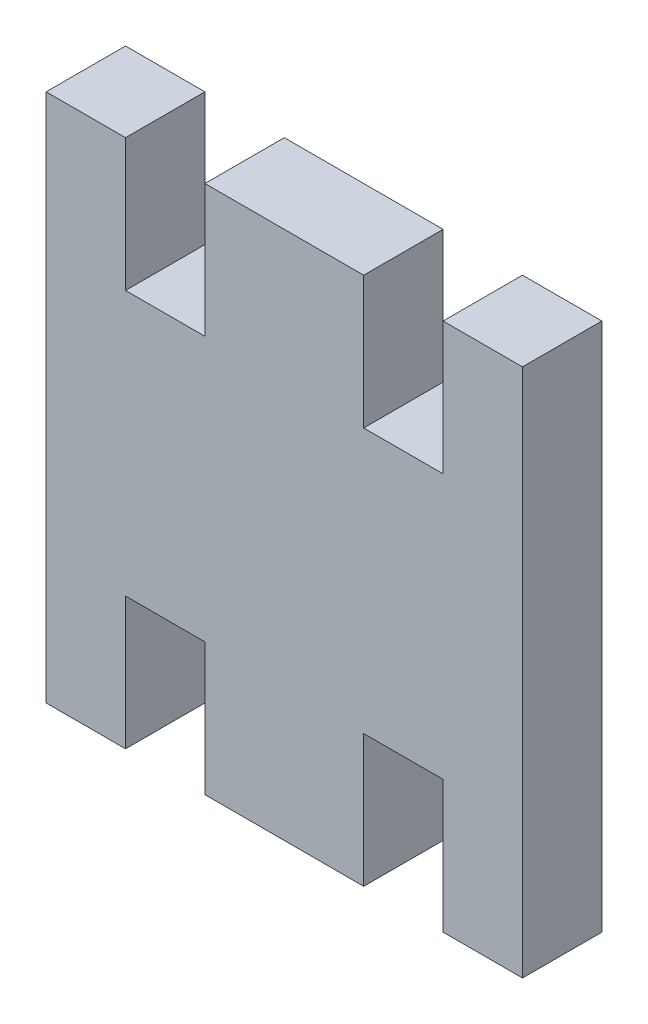
ISO-10303-21;
HEADER;
FILE_DESCRIPTION(('STEP AP214'),'2;1');
FILE_NAME('part.step','',(''),(''),'','','');
FILE_SCHEMA(('AUTOMOTIVE_DESIGN { 1 0 10303 214 1 1 1 1 }'));
ENDSEC;
DATA;
#1=APPLICATION_CONTEXT('core data for automotive mechanical design processes');
#2=APPLICATION_PROTOCOL_DEFINITION('international standard','automotive_design',2000,#1);
#3=PRODUCT_CONTEXT('',#1,'mechanical');
#4=PRODUCT('Part','Part','',(#3));
#5=PRODUCT_RELATED_PRODUCT_CATEGORY('part','',(#4));
#6=PRODUCT_DEFINITION_FORMATION('','',#4);
#7=PRODUCT_DEFINITION_CONTEXT('part definition',#1,'design');
#8=PRODUCT_DEFINITION('design','',#6,#7);
#9=PRODUCT_DEFINITION_SHAPE('','',#8);
#10=(LENGTH_UNIT() NAMED_UNIT(*) SI_UNIT(.MILLI.,.METRE.));
#11=(NAMED_UNIT(*) PLANE_ANGLE_UNIT() SI_UNIT($,.RADIAN.));
#12=(NAMED_UNIT(*) SI_UNIT($,.STERADIAN.) SOLID_ANGLE_UNIT());
#13=UNCERTAINTY_MEASURE_WITH_UNIT(LENGTH_MEASURE(1.E-05),#10,'distance_accuracy_value','');
#14=(GEOMETRIC_REPRESENTATION_CONTEXT(3) GLOBAL_UNCERTAINTY_ASSIGNED_CONTEXT((#13)) GLOBAL_UNIT_ASSIGNED_CONTEXT((#10,
#11,#12)) REPRESENTATION_CONTEXT('',''));
#15=CARTESIAN_POINT('',(0.,0.,0.));
#16=DIRECTION('',(0.,0.,1.));
#17=DIRECTION('',(1.,0.,0.));
#18=AXIS2_PLACEMENT_3D('',#15,#16,#17);
#19=CARTESIAN_POINT('',(0.,40.,6.));
#20=DIRECTION('',(0.,-1.,0.));
#21=DIRECTION('',(1.,0.,0.));
#22=AXIS2_PLACEMENT_3D('',#19,#20,#21);
#23=PLANE('',#22);
#24=DIRECTION('',(-1.,0.,0.));
#25=VECTOR('',#24,1.);
#26=CARTESIAN_POINT('',(0.,40.,6.));
#27=LINE('',#26,#25);
#28=CARTESIAN_POINT('',(-12.,40.,6.));
#29=VERTEX_POINT('',#28);
#30=CARTESIAN_POINT('',(-24.,40.,6.));
#31=VERTEX_POINT('',#30);
#32=EDGE_CURVE('E257',#29,#31,#27,.T.);
#33=ORIENTED_EDGE('',*,*,#32,.F.);
#34=DIRECTION('',(0.,0.,1.));
#35=VECTOR('',#34,1.);
#36=CARTESIAN_POINT('',(-12.,40.,0.));
#37=LINE('',#36,#35);
#38=CARTESIAN_POINT('',(-12.,40.,0.));
#39=VERTEX_POINT('',#38);
#40=EDGE_CURVE('E343',#39,#29,#37,.T.);
#41=ORIENTED_EDGE('',*,*,#40,.F.);
#42=DIRECTION('',(-1.,0.,0.));
#43=VECTOR('',#42,1.);
#44=CARTESIAN_POINT('',(0.,40.,0.));
#45=LINE('',#44,#43);
#46=CARTESIAN_POINT('',(-24.,40.,0.));
#47=VERTEX_POINT('',#46);
#48=EDGE_CURVE('E236',#39,#47,#45,.T.);
#49=ORIENTED_EDGE('',*,*,#48,.T.);
#50=DIRECTION('',(0.,0.,1.));
#51=VECTOR('',#50,1.);
#52=CARTESIAN_POINT('',(-24.,40.,0.));
#53=LINE('',#52,#51);
#54=EDGE_CURVE('E266',#47,#31,#53,.T.);
#55=ORIENTED_EDGE('',*,*,#54,.T.);
#56=EDGE_LOOP('',(#33,#41,#49,#55));
#57=FACE_BOUND('',#56,.T.);
#58=ADVANCED_FACE('F45',(#57),#23,.F.);
#59=CARTESIAN_POINT('',(0.,0.,6.));
#60=DIRECTION('',(0.,1.,0.));
#61=DIRECTION('',(0.,0.,1.));
#62=AXIS2_PLACEMENT_3D('',#59,#60,#61);
#63=PLANE('',#62);
#64=DIRECTION('',(1.,0.,0.));
#65=VECTOR('',#64,1.);
#66=CARTESIAN_POINT('',(0.,0.,0.));
#67=LINE('',#66,#65);
#68=CARTESIAN_POINT('',(-36.,0.,0.));
#69=VERTEX_POINT('',#68);
#70=CARTESIAN_POINT('',(-30.,0.,0.));
#71=VERTEX_POINT('',#70);
#72=EDGE_CURVE('E200',#69,#71,#67,.T.);
#73=ORIENTED_EDGE('',*,*,#72,.T.);
#74=DIRECTION('',(0.,0.,1.));
#75=VECTOR('',#74,1.);
#76=CARTESIAN_POINT('',(-30.,0.,0.));
#77=LINE('',#76,#75);
#78=CARTESIAN_POINT('',(-30.,0.,6.));
#79=VERTEX_POINT('',#78);
#80=EDGE_CURVE('E183',#71,#79,#77,.T.);
#81=ORIENTED_EDGE('',*,*,#80,.T.);
#82=DIRECTION('',(1.,0.,0.));
#83=VECTOR('',#82,1.);
#84=CARTESIAN_POINT('',(0.,0.,6.));
#85=LINE('',#84,#83);
#86=CARTESIAN_POINT('',(-36.,0.,6.));
#87=VERTEX_POINT('',#86);
#88=EDGE_CURVE('E245',#87,#79,#85,.T.);
#89=ORIENTED_EDGE('',*,*,#88,.F.);
#90=DIRECTION('',(0.,0.,-1.));
#91=VECTOR('',#90,1.);
#92=CARTESIAN_POINT('',(-36.,0.,6.));
#93=LINE('',#92,#91);
#94=EDGE_CURVE('E209',#87,#69,#93,.T.);
#95=ORIENTED_EDGE('',*,*,#94,.T.);
#96=EDGE_LOOP('',(#73,#81,#89,#95));
#97=FACE_BOUND('',#96,.T.);
#98=ADVANCED_FACE('F207',(#97),#63,.F.);
#99=CARTESIAN_POINT('',(-24.,0.,6.));
#100=VERTEX_POINT('',#99);
#101=CARTESIAN_POINT('',(-12.,0.,6.));
#102=VERTEX_POINT('',#101);
#103=EDGE_CURVE('E249',#100,#102,#85,.T.);
#104=ORIENTED_EDGE('',*,*,#103,.F.);
#105=DIRECTION('',(0.,0.,1.));
#106=VECTOR('',#105,1.);
#107=CARTESIAN_POINT('',(-24.,0.,0.));
#108=LINE('',#107,#106);
#109=CARTESIAN_POINT('',(-24.,0.,0.));
#110=VERTEX_POINT('',#109);
#111=EDGE_CURVE('E194',#110,#100,#108,.T.);
#112=ORIENTED_EDGE('',*,*,#111,.F.);
#113=CARTESIAN_POINT('',(-12.,0.,0.));
#114=VERTEX_POINT('',#113);
#115=EDGE_CURVE('E212',#110,#114,#67,.T.);
#116=ORIENTED_EDGE('',*,*,#115,.T.);
#117=DIRECTION('',(0.,0.,1.));
#118=VECTOR('',#117,1.);
#119=CARTESIAN_POINT('',(-12.,0.,0.));
#120=LINE('',#119,#118);
#121=EDGE_CURVE('E296',#114,#102,#120,.T.);
#122=ORIENTED_EDGE('',*,*,#121,.T.);
#123=EDGE_LOOP('',(#104,#112,#116,#122));
#124=FACE_BOUND('',#123,.T.);
#125=ADVANCED_FACE('F392',(#124),#63,.F.);
#126=CARTESIAN_POINT('',(-30.,40.,6.));
#127=VERTEX_POINT('',#126);
#128=CARTESIAN_POINT('',(-36.,40.,6.));
#129=VERTEX_POINT('',#128);
#130=EDGE_CURVE('E218',#127,#129,#27,.T.);
#131=ORIENTED_EDGE('',*,*,#130,.F.);
#132=DIRECTION('',(0.,0.,1.));
#133=VECTOR('',#132,1.);
#134=CARTESIAN_POINT('',(-30.,40.,0.));
#135=LINE('',#134,#133);
#136=CARTESIAN_POINT('',(-30.,40.,0.));
#137=VERTEX_POINT('',#136);
#138=EDGE_CURVE('E244',#137,#127,#135,.T.);
#139=ORIENTED_EDGE('',*,*,#138,.F.);
#140=CARTESIAN_POINT('',(-36.,40.,0.));
#141=VERTEX_POINT('',#140);
#142=EDGE_CURVE('E238',#137,#141,#45,.T.);
#143=ORIENTED_EDGE('',*,*,#142,.T.);
#144=DIRECTION('',(0.,0.,-1.));
#145=VECTOR('',#144,1.);
#146=CARTESIAN_POINT('',(-36.,40.,6.));
#147=LINE('',#146,#145);
#148=EDGE_CURVE('E54',#129,#141,#147,.T.);
#149=ORIENTED_EDGE('',*,*,#148,.F.);
#150=EDGE_LOOP('',(#131,#139,#143,#149));
#151=FACE_BOUND('',#150,.T.);
#152=ADVANCED_FACE('F434',(#151),#23,.F.);
#153=CARTESIAN_POINT('',(0.,0.,6.));
#154=DIRECTION('',(-1.,0.,0.));
#155=DIRECTION('',(0.,0.,1.));
#156=AXIS2_PLACEMENT_3D('',#153,#154,#155);
#157=PLANE('',#156);
#158=DIRECTION('',(0.,1.,0.));
#159=VECTOR('',#158,1.);
#160=CARTESIAN_POINT('',(0.,0.,0.));
#161=LINE('',#160,#159);
#162=CARTESIAN_POINT('',(0.,0.,0.));
#163=VERTEX_POINT('',#162);
#164=CARTESIAN_POINT('',(0.,40.,0.));
#165=VERTEX_POINT('',#164);
#166=EDGE_CURVE('E240',#163,#165,#161,.T.);
#167=ORIENTED_EDGE('',*,*,#166,.T.);
#168=DIRECTION('',(0.,0.,-1.));
#169=VECTOR('',#168,1.);
#170=CARTESIAN_POINT('',(0.,40.,6.));
#171=LINE('',#170,#169);
#172=CARTESIAN_POINT('',(0.,40.,6.));
#173=VERTEX_POINT('',#172);
#174=EDGE_CURVE('E11',#173,#165,#171,.T.);
#175=ORIENTED_EDGE('',*,*,#174,.F.);
#176=DIRECTION('',(0.,1.,0.));
#177=VECTOR('',#176,1.);
#178=CARTESIAN_POINT('',(0.,0.,6.));
#179=LINE('',#178,#177);
#180=CARTESIAN_POINT('',(0.,0.,6.));
#181=VERTEX_POINT('',#180);
#182=EDGE_CURVE('E211',#181,#173,#179,.T.);
#183=ORIENTED_EDGE('',*,*,#182,.F.);
#184=DIRECTION('',(0.,0.,-1.));
#185=VECTOR('',#184,1.);
#186=CARTESIAN_POINT('',(0.,0.,6.));
#187=LINE('',#186,#185);
#188=EDGE_CURVE('E248',#181,#163,#187,.T.);
#189=ORIENTED_EDGE('',*,*,#188,.T.);
#190=EDGE_LOOP('',(#167,#175,#183,#189));
#191=FACE_BOUND('',#190,.T.);
#192=ADVANCED_FACE('F47',(#191),#157,.F.);
#193=CARTESIAN_POINT('',(-6.,40.,0.));
#194=VERTEX_POINT('',#193);
#195=EDGE_CURVE('E231',#165,#194,#45,.T.);
#196=ORIENTED_EDGE('',*,*,#195,.T.);
#197=DIRECTION('',(0.,0.,1.));
#198=VECTOR('',#197,1.);
#199=CARTESIAN_POINT('',(-6.,40.,0.));
#200=LINE('',#199,#198);
#201=CARTESIAN_POINT('',(-6.,40.,6.));
#202=VERTEX_POINT('',#201);
#203=EDGE_CURVE('E339',#194,#202,#200,.T.);
#204=ORIENTED_EDGE('',*,*,#203,.T.);
#205=EDGE_CURVE('E254',#173,#202,#27,.T.);
#206=ORIENTED_EDGE('',*,*,#205,.F.);
#207=ORIENTED_EDGE('',*,*,#174,.T.);
#208=EDGE_LOOP('',(#196,#204,#206,#207));
#209=FACE_BOUND('',#208,.T.);
#210=ADVANCED_FACE('F409',(#209),#23,.F.);
#211=CARTESIAN_POINT('',(-36.,0.,6.));
#212=DIRECTION('',(1.,0.,0.));
#213=DIRECTION('',(0.,0.,-1.));
#214=AXIS2_PLACEMENT_3D('',#211,#212,#213);
#215=PLANE('',#214);
#216=DIRECTION('',(0.,-1.,0.));
#217=VECTOR('',#216,1.);
#218=CARTESIAN_POINT('',(-36.,0.,0.));
#219=LINE('',#218,#217);
#220=EDGE_CURVE('E224',#141,#69,#219,.T.);
#221=ORIENTED_EDGE('',*,*,#220,.T.);
#222=ORIENTED_EDGE('',*,*,#94,.F.);
#223=DIRECTION('',(0.,-1.,0.));
#224=VECTOR('',#223,1.);
#225=CARTESIAN_POINT('',(-36.,0.,6.));
#226=LINE('',#225,#224);
#227=EDGE_CURVE('E251',#129,#87,#226,.T.);
#228=ORIENTED_EDGE('',*,*,#227,.F.);
#229=ORIENTED_EDGE('',*,*,#148,.T.);
#230=EDGE_LOOP('',(#221,#222,#228,#229));
#231=FACE_BOUND('',#230,.T.);
#232=ADVANCED_FACE('F437',(#231),#215,.F.);
#233=CARTESIAN_POINT('',(-6.,0.,6.));
#234=VERTEX_POINT('',#233);
#235=EDGE_CURVE('E250',#234,#181,#85,.T.);
#236=ORIENTED_EDGE('',*,*,#235,.F.);
#237=DIRECTION('',(0.,0.,1.));
#238=VECTOR('',#237,1.);
#239=CARTESIAN_POINT('',(-6.,0.,0.));
#240=LINE('',#239,#238);
#241=CARTESIAN_POINT('',(-6.,0.,0.));
#242=VERTEX_POINT('',#241);
#243=EDGE_CURVE('E300',#242,#234,#240,.T.);
#244=ORIENTED_EDGE('',*,*,#243,.F.);
#245=EDGE_CURVE('E214',#242,#163,#67,.T.);
#246=ORIENTED_EDGE('',*,*,#245,.T.);
#247=ORIENTED_EDGE('',*,*,#188,.F.);
#248=EDGE_LOOP('',(#236,#244,#246,#247));
#249=FACE_BOUND('',#248,.T.);
#250=ADVANCED_FACE('F404',(#249),#63,.F.);
#251=CARTESIAN_POINT('',(0.,0.,6.));
#252=DIRECTION('',(0.,0.,1.));
#253=DIRECTION('',(1.,0.,0.));
#254=AXIS2_PLACEMENT_3D('',#251,#252,#253);
#255=PLANE('',#254);
#256=DIRECTION('',(0.,-1.,0.));
#257=VECTOR('',#256,1.);
#258=CARTESIAN_POINT('',(-30.,10.,6.));
#259=LINE('',#258,#257);
#260=CARTESIAN_POINT('',(-30.,10.,6.));
#261=VERTEX_POINT('',#260);
#262=EDGE_CURVE('E188',#261,#79,#259,.T.);
#263=ORIENTED_EDGE('',*,*,#262,.F.);
#264=DIRECTION('',(-1.,0.,0.));
#265=VECTOR('',#264,1.);
#266=CARTESIAN_POINT('',(-30.,10.,6.));
#267=LINE('',#266,#265);
#268=CARTESIAN_POINT('',(-24.,10.,6.));
#269=VERTEX_POINT('',#268);
#270=EDGE_CURVE('E204',#269,#261,#267,.T.);
#271=ORIENTED_EDGE('',*,*,#270,.F.);
#272=DIRECTION('',(0.,1.,0.));
#273=VECTOR('',#272,1.);
#274=CARTESIAN_POINT('',(-24.,10.,6.));
#275=LINE('',#274,#273);
#276=EDGE_CURVE('E376',#100,#269,#275,.T.);
#277=ORIENTED_EDGE('',*,*,#276,.F.);
#278=ORIENTED_EDGE('',*,*,#103,.T.);
#279=DIRECTION('',(0.,-1.,0.));
#280=VECTOR('',#279,1.);
#281=CARTESIAN_POINT('',(-12.,10.,6.));
#282=LINE('',#281,#280);
#283=CARTESIAN_POINT('',(-12.,10.,6.));
#284=VERTEX_POINT('',#283);
#285=EDGE_CURVE('E320',#284,#102,#282,.T.);
#286=ORIENTED_EDGE('',*,*,#285,.F.);
#287=DIRECTION('',(-1.,0.,0.));
#288=VECTOR('',#287,1.);
#289=CARTESIAN_POINT('',(-12.,10.,6.));
#290=LINE('',#289,#288);
#291=CARTESIAN_POINT('',(-6.,10.,6.));
#292=VERTEX_POINT('',#291);
#293=EDGE_CURVE('E311',#292,#284,#290,.T.);
#294=ORIENTED_EDGE('',*,*,#293,.F.);
#295=DIRECTION('',(0.,1.,0.));
#296=VECTOR('',#295,1.);
#297=CARTESIAN_POINT('',(-6.,10.,6.));
#298=LINE('',#297,#296);
#299=EDGE_CURVE('E316',#234,#292,#298,.T.);
#300=ORIENTED_EDGE('',*,*,#299,.F.);
#301=ORIENTED_EDGE('',*,*,#235,.T.);
#302=ORIENTED_EDGE('',*,*,#182,.T.);
#303=ORIENTED_EDGE('',*,*,#205,.T.);
#304=DIRECTION('',(0.,1.,0.));
#305=VECTOR('',#304,1.);
#306=CARTESIAN_POINT('',(-6.,40.,6.));
#307=LINE('',#306,#305);
#308=CARTESIAN_POINT('',(-6.,30.,6.));
#309=VERTEX_POINT('',#308);
#310=EDGE_CURVE('E346',#309,#202,#307,.T.);
#311=ORIENTED_EDGE('',*,*,#310,.F.);
#312=DIRECTION('',(1.,0.,0.));
#313=VECTOR('',#312,1.);
#314=CARTESIAN_POINT('',(-12.,30.,6.));
#315=LINE('',#314,#313);
#316=CARTESIAN_POINT('',(-12.,30.,6.));
#317=VERTEX_POINT('',#316);
#318=EDGE_CURVE('E350',#317,#309,#315,.T.);
#319=ORIENTED_EDGE('',*,*,#318,.F.);
#320=DIRECTION('',(0.,-1.,0.));
#321=VECTOR('',#320,1.);
#322=CARTESIAN_POINT('',(-12.,40.,6.));
#323=LINE('',#322,#321);
#324=EDGE_CURVE('E310',#29,#317,#323,.T.);
#325=ORIENTED_EDGE('',*,*,#324,.F.);
#326=ORIENTED_EDGE('',*,*,#32,.T.);
#327=DIRECTION('',(0.,1.,0.));
#328=VECTOR('',#327,1.);
#329=CARTESIAN_POINT('',(-24.,40.,6.));
#330=LINE('',#329,#328);
#331=CARTESIAN_POINT('',(-24.,30.,6.));
#332=VERTEX_POINT('',#331);
#333=EDGE_CURVE('E272',#332,#31,#330,.T.);
#334=ORIENTED_EDGE('',*,*,#333,.F.);
#335=DIRECTION('',(1.,0.,0.));
#336=VECTOR('',#335,1.);
#337=CARTESIAN_POINT('',(-30.,30.,6.));
#338=LINE('',#337,#336);
#339=CARTESIAN_POINT('',(-30.,30.,6.));
#340=VERTEX_POINT('',#339);
#341=EDGE_CURVE('E277',#340,#332,#338,.T.);
#342=ORIENTED_EDGE('',*,*,#341,.F.);
#343=DIRECTION('',(0.,-1.,0.));
#344=VECTOR('',#343,1.);
#345=CARTESIAN_POINT('',(-30.,40.,6.));
#346=LINE('',#345,#344);
#347=EDGE_CURVE('E281',#127,#340,#346,.T.);
#348=ORIENTED_EDGE('',*,*,#347,.F.);
#349=ORIENTED_EDGE('',*,*,#130,.T.);
#350=ORIENTED_EDGE('',*,*,#227,.T.);
#351=ORIENTED_EDGE('',*,*,#88,.T.);
#352=EDGE_LOOP('',(#263,#271,#277,#278,#286,#294,#300,#301,#302,#303,#311,#319,#325,#326,#334,
#342,#348,#349,#350,#351));
#353=FACE_BOUND('',#352,.T.);
#354=ADVANCED_FACE('F400',(#353),#255,.T.);
#355=CARTESIAN_POINT('',(0.,0.,0.));
#356=DIRECTION('',(0.,0.,1.));
#357=DIRECTION('',(1.,0.,0.));
#358=AXIS2_PLACEMENT_3D('',#355,#356,#357);
#359=PLANE('',#358);
#360=DIRECTION('',(-1.,0.,0.));
#361=VECTOR('',#360,1.);
#362=CARTESIAN_POINT('',(-30.,10.,0.));
#363=LINE('',#362,#361);
#364=CARTESIAN_POINT('',(-24.,10.,0.));
#365=VERTEX_POINT('',#364);
#366=CARTESIAN_POINT('',(-30.,10.,0.));
#367=VERTEX_POINT('',#366);
#368=EDGE_CURVE('E61',#365,#367,#363,.T.);
#369=ORIENTED_EDGE('',*,*,#368,.T.);
#370=DIRECTION('',(0.,-1.,0.));
#371=VECTOR('',#370,1.);
#372=CARTESIAN_POINT('',(-30.,10.,0.));
#373=LINE('',#372,#371);
#374=EDGE_CURVE('E186',#367,#71,#373,.T.);
#375=ORIENTED_EDGE('',*,*,#374,.T.);
#376=ORIENTED_EDGE('',*,*,#72,.F.);
#377=ORIENTED_EDGE('',*,*,#220,.F.);
#378=ORIENTED_EDGE('',*,*,#142,.F.);
#379=DIRECTION('',(0.,-1.,0.));
#380=VECTOR('',#379,1.);
#381=CARTESIAN_POINT('',(-30.,40.,0.));
#382=LINE('',#381,#380);
#383=CARTESIAN_POINT('',(-30.,30.,0.));
#384=VERTEX_POINT('',#383);
#385=EDGE_CURVE('E276',#137,#384,#382,.T.);
#386=ORIENTED_EDGE('',*,*,#385,.T.);
#387=DIRECTION('',(1.,0.,0.));
#388=VECTOR('',#387,1.);
#389=CARTESIAN_POINT('',(-30.,30.,0.));
#390=LINE('',#389,#388);
#391=CARTESIAN_POINT('',(-24.,30.,0.));
#392=VERTEX_POINT('',#391);
#393=EDGE_CURVE('E289',#384,#392,#390,.T.);
#394=ORIENTED_EDGE('',*,*,#393,.T.);
#395=DIRECTION('',(0.,1.,0.));
#396=VECTOR('',#395,1.);
#397=CARTESIAN_POINT('',(-24.,40.,0.));
#398=LINE('',#397,#396);
#399=EDGE_CURVE('E263',#392,#47,#398,.T.);
#400=ORIENTED_EDGE('',*,*,#399,.T.);
#401=ORIENTED_EDGE('',*,*,#48,.F.);
#402=DIRECTION('',(0.,-1.,0.));
#403=VECTOR('',#402,1.);
#404=CARTESIAN_POINT('',(-12.,40.,0.));
#405=LINE('',#404,#403);
#406=CARTESIAN_POINT('',(-12.,30.,0.));
#407=VERTEX_POINT('',#406);
#408=EDGE_CURVE('E349',#39,#407,#405,.T.);
#409=ORIENTED_EDGE('',*,*,#408,.T.);
#410=DIRECTION('',(1.,0.,0.));
#411=VECTOR('',#410,1.);
#412=CARTESIAN_POINT('',(-12.,30.,0.));
#413=LINE('',#412,#411);
#414=CARTESIAN_POINT('',(-6.,30.,0.));
#415=VERTEX_POINT('',#414);
#416=EDGE_CURVE('E359',#407,#415,#413,.T.);
#417=ORIENTED_EDGE('',*,*,#416,.T.);
#418=DIRECTION('',(0.,1.,0.));
#419=VECTOR('',#418,1.);
#420=CARTESIAN_POINT('',(-6.,40.,0.));
#421=LINE('',#420,#419);
#422=EDGE_CURVE('E69',#415,#194,#421,.T.);
#423=ORIENTED_EDGE('',*,*,#422,.T.);
#424=ORIENTED_EDGE('',*,*,#195,.F.);
#425=ORIENTED_EDGE('',*,*,#166,.F.);
#426=ORIENTED_EDGE('',*,*,#245,.F.);
#427=DIRECTION('',(0.,1.,0.));
#428=VECTOR('',#427,1.);
#429=CARTESIAN_POINT('',(-6.,10.,0.));
#430=LINE('',#429,#428);
#431=CARTESIAN_POINT('',(-6.,10.,0.));
#432=VERTEX_POINT('',#431);
#433=EDGE_CURVE('E326',#242,#432,#430,.T.);
#434=ORIENTED_EDGE('',*,*,#433,.T.);
#435=DIRECTION('',(-1.,0.,0.));
#436=VECTOR('',#435,1.);
#437=CARTESIAN_POINT('',(-12.,10.,0.));
#438=LINE('',#437,#436);
#439=CARTESIAN_POINT('',(-12.,10.,0.));
#440=VERTEX_POINT('',#439);
#441=EDGE_CURVE('E301',#432,#440,#438,.T.);
#442=ORIENTED_EDGE('',*,*,#441,.T.);
#443=DIRECTION('',(0.,-1.,0.));
#444=VECTOR('',#443,1.);
#445=CARTESIAN_POINT('',(-12.,10.,0.));
#446=LINE('',#445,#444);
#447=EDGE_CURVE('E315',#440,#114,#446,.T.);
#448=ORIENTED_EDGE('',*,*,#447,.T.);
#449=ORIENTED_EDGE('',*,*,#115,.F.);
#450=DIRECTION('',(0.,1.,0.));
#451=VECTOR('',#450,1.);
#452=CARTESIAN_POINT('',(-24.,10.,0.));
#453=LINE('',#452,#451);
#454=EDGE_CURVE('E203',#110,#365,#453,.T.);
#455=ORIENTED_EDGE('',*,*,#454,.T.);
#456=EDGE_LOOP('',(#369,#375,#376,#377,#378,#386,#394,#400,#401,#409,#417,#423,#424,#425,#426,
#434,#442,#448,#449,#455));
#457=FACE_BOUND('',#456,.T.);
#458=ADVANCED_FACE('F198',(#457),#359,.F.);
#459=CARTESIAN_POINT('',(-30.,40.,0.));
#460=DIRECTION('',(-1.,0.,0.));
#461=DIRECTION('',(0.,0.,1.));
#462=AXIS2_PLACEMENT_3D('',#459,#460,#461);
#463=PLANE('',#462);
#464=ORIENTED_EDGE('',*,*,#347,.T.);
#465=DIRECTION('',(0.,0.,1.));
#466=VECTOR('',#465,1.);
#467=CARTESIAN_POINT('',(-30.,30.,0.));
#468=LINE('',#467,#466);
#469=EDGE_CURVE('E259',#384,#340,#468,.T.);
#470=ORIENTED_EDGE('',*,*,#469,.F.);
#471=ORIENTED_EDGE('',*,*,#385,.F.);
#472=ORIENTED_EDGE('',*,*,#138,.T.);
#473=EDGE_LOOP('',(#464,#470,#471,#472));
#474=FACE_BOUND('',#473,.T.);
#475=ADVANCED_FACE('F508',(#474),#463,.F.);
#476=CARTESIAN_POINT('',(-24.,40.,0.));
#477=DIRECTION('',(1.,0.,0.));
#478=DIRECTION('',(0.,0.,-1.));
#479=AXIS2_PLACEMENT_3D('',#476,#477,#478);
#480=PLANE('',#479);
#481=ORIENTED_EDGE('',*,*,#333,.T.);
#482=ORIENTED_EDGE('',*,*,#54,.F.);
#483=ORIENTED_EDGE('',*,*,#399,.F.);
#484=DIRECTION('',(0.,0.,1.));
#485=VECTOR('',#484,1.);
#486=CARTESIAN_POINT('',(-24.,30.,0.));
#487=LINE('',#486,#485);
#488=EDGE_CURVE('E262',#392,#332,#487,.T.);
#489=ORIENTED_EDGE('',*,*,#488,.T.);
#490=EDGE_LOOP('',(#481,#482,#483,#489));
#491=FACE_BOUND('',#490,.T.);
#492=ADVANCED_FACE('F497',(#491),#480,.F.);
#493=CARTESIAN_POINT('',(-30.,30.,0.));
#494=DIRECTION('',(0.,-1.,0.));
#495=DIRECTION('',(0.,0.,-1.));
#496=AXIS2_PLACEMENT_3D('',#493,#494,#495);
#497=PLANE('',#496);
#498=ORIENTED_EDGE('',*,*,#341,.T.);
#499=ORIENTED_EDGE('',*,*,#488,.F.);
#500=ORIENTED_EDGE('',*,*,#393,.F.);
#501=ORIENTED_EDGE('',*,*,#469,.T.);
#502=EDGE_LOOP('',(#498,#499,#500,#501));
#503=FACE_BOUND('',#502,.T.);
#504=ADVANCED_FACE('F491',(#503),#497,.F.);
#505=CARTESIAN_POINT('',(-12.,10.,0.));
#506=DIRECTION('',(-1.,0.,0.));
#507=DIRECTION('',(0.,0.,1.));
#508=AXIS2_PLACEMENT_3D('',#505,#506,#507);
#509=PLANE('',#508);
#510=ORIENTED_EDGE('',*,*,#285,.T.);
#511=ORIENTED_EDGE('',*,*,#121,.F.);
#512=ORIENTED_EDGE('',*,*,#447,.F.);
#513=DIRECTION('',(0.,0.,1.));
#514=VECTOR('',#513,1.);
#515=CARTESIAN_POINT('',(-12.,10.,0.));
#516=LINE('',#515,#514);
#517=EDGE_CURVE('E307',#440,#284,#516,.T.);
#518=ORIENTED_EDGE('',*,*,#517,.T.);
#519=EDGE_LOOP('',(#510,#511,#512,#518));
#520=FACE_BOUND('',#519,.T.);
#521=ADVANCED_FACE('F496',(#520),#509,.F.);
#522=CARTESIAN_POINT('',(-12.,10.,0.));
#523=DIRECTION('',(0.,1.,0.));
#524=DIRECTION('',(0.,0.,1.));
#525=AXIS2_PLACEMENT_3D('',#522,#523,#524);
#526=PLANE('',#525);
#527=ORIENTED_EDGE('',*,*,#293,.T.);
#528=ORIENTED_EDGE('',*,*,#517,.F.);
#529=ORIENTED_EDGE('',*,*,#441,.F.);
#530=DIRECTION('',(0.,0.,1.));
#531=VECTOR('',#530,1.);
#532=CARTESIAN_POINT('',(-6.,10.,0.));
#533=LINE('',#532,#531);
#534=EDGE_CURVE('E304',#432,#292,#533,.T.);
#535=ORIENTED_EDGE('',*,*,#534,.T.);
#536=EDGE_LOOP('',(#527,#528,#529,#535));
#537=FACE_BOUND('',#536,.T.);
#538=ADVANCED_FACE('F585',(#537),#526,.F.);
#539=CARTESIAN_POINT('',(-6.,10.,0.));
#540=DIRECTION('',(1.,0.,0.));
#541=DIRECTION('',(0.,0.,-1.));
#542=AXIS2_PLACEMENT_3D('',#539,#540,#541);
#543=PLANE('',#542);
#544=ORIENTED_EDGE('',*,*,#299,.T.);
#545=ORIENTED_EDGE('',*,*,#534,.F.);
#546=ORIENTED_EDGE('',*,*,#433,.F.);
#547=ORIENTED_EDGE('',*,*,#243,.T.);
#548=EDGE_LOOP('',(#544,#545,#546,#547));
#549=FACE_BOUND('',#548,.T.);
#550=ADVANCED_FACE('F587',(#549),#543,.F.);
#551=CARTESIAN_POINT('',(-12.,40.,0.));
#552=DIRECTION('',(-1.,0.,0.));
#553=DIRECTION('',(0.,0.,1.));
#554=AXIS2_PLACEMENT_3D('',#551,#552,#553);
#555=PLANE('',#554);
#556=ORIENTED_EDGE('',*,*,#324,.T.);
#557=DIRECTION('',(0.,0.,1.));
#558=VECTOR('',#557,1.);
#559=CARTESIAN_POINT('',(-12.,30.,0.));
#560=LINE('',#559,#558);
#561=EDGE_CURVE('E333',#407,#317,#560,.T.);
#562=ORIENTED_EDGE('',*,*,#561,.F.);
#563=ORIENTED_EDGE('',*,*,#408,.F.);
#564=ORIENTED_EDGE('',*,*,#40,.T.);
#565=EDGE_LOOP('',(#556,#562,#563,#564));
#566=FACE_BOUND('',#565,.T.);
#567=ADVANCED_FACE('F418',(#566),#555,.F.);
#568=CARTESIAN_POINT('',(-6.,40.,0.));
#569=DIRECTION('',(1.,0.,0.));
#570=DIRECTION('',(0.,0.,-1.));
#571=AXIS2_PLACEMENT_3D('',#568,#569,#570);
#572=PLANE('',#571);
#573=ORIENTED_EDGE('',*,*,#310,.T.);
#574=ORIENTED_EDGE('',*,*,#203,.F.);
#575=ORIENTED_EDGE('',*,*,#422,.F.);
#576=DIRECTION('',(0.,0.,1.));
#577=VECTOR('',#576,1.);
#578=CARTESIAN_POINT('',(-6.,30.,0.));
#579=LINE('',#578,#577);
#580=EDGE_CURVE('E336',#415,#309,#579,.T.);
#581=ORIENTED_EDGE('',*,*,#580,.T.);
#582=EDGE_LOOP('',(#573,#574,#575,#581));
#583=FACE_BOUND('',#582,.T.);
#584=ADVANCED_FACE('F413',(#583),#572,.F.);
#585=CARTESIAN_POINT('',(-12.,30.,0.));
#586=DIRECTION('',(0.,-1.,0.));
#587=DIRECTION('',(0.,0.,-1.));
#588=AXIS2_PLACEMENT_3D('',#585,#586,#587);
#589=PLANE('',#588);
#590=ORIENTED_EDGE('',*,*,#318,.T.);
#591=ORIENTED_EDGE('',*,*,#580,.F.);
#592=ORIENTED_EDGE('',*,*,#416,.F.);
#593=ORIENTED_EDGE('',*,*,#561,.T.);
#594=EDGE_LOOP('',(#590,#591,#592,#593));
#595=FACE_BOUND('',#594,.T.);
#596=ADVANCED_FACE('F416',(#595),#589,.F.);
#597=CARTESIAN_POINT('',(-30.,10.,0.));
#598=DIRECTION('',(-1.,0.,0.));
#599=DIRECTION('',(0.,0.,1.));
#600=AXIS2_PLACEMENT_3D('',#597,#598,#599);
#601=PLANE('',#600);
#602=ORIENTED_EDGE('',*,*,#262,.T.);
#603=ORIENTED_EDGE('',*,*,#80,.F.);
#604=ORIENTED_EDGE('',*,*,#374,.F.);
#605=DIRECTION('',(0.,0.,1.));
#606=VECTOR('',#605,1.);
#607=CARTESIAN_POINT('',(-30.,10.,0.));
#608=LINE('',#607,#606);
#609=EDGE_CURVE('E285',#367,#261,#608,.T.);
#610=ORIENTED_EDGE('',*,*,#609,.T.);
#611=EDGE_LOOP('',(#602,#603,#604,#610));
#612=FACE_BOUND('',#611,.T.);
#613=ADVANCED_FACE('F185',(#612),#601,.F.);
#614=CARTESIAN_POINT('',(-30.,10.,0.));
#615=DIRECTION('',(0.,1.,0.));
#616=DIRECTION('',(0.,0.,1.));
#617=AXIS2_PLACEMENT_3D('',#614,#615,#616);
#618=PLANE('',#617);
#619=ORIENTED_EDGE('',*,*,#270,.T.);
#620=ORIENTED_EDGE('',*,*,#609,.F.);
#621=ORIENTED_EDGE('',*,*,#368,.F.);
#622=DIRECTION('',(0.,0.,1.));
#623=VECTOR('',#622,1.);
#624=CARTESIAN_POINT('',(-24.,10.,0.));
#625=LINE('',#624,#623);
#626=EDGE_CURVE('E368',#365,#269,#625,.T.);
#627=ORIENTED_EDGE('',*,*,#626,.T.);
#628=EDGE_LOOP('',(#619,#620,#621,#627));
#629=FACE_BOUND('',#628,.T.);
#630=ADVANCED_FACE('F441',(#629),#618,.F.);
#631=CARTESIAN_POINT('',(-24.,10.,0.));
#632=DIRECTION('',(1.,0.,0.));
#633=DIRECTION('',(0.,0.,-1.));
#634=AXIS2_PLACEMENT_3D('',#631,#632,#633);
#635=PLANE('',#634);
#636=ORIENTED_EDGE('',*,*,#276,.T.);
#637=ORIENTED_EDGE('',*,*,#626,.F.);
#638=ORIENTED_EDGE('',*,*,#454,.F.);
#639=ORIENTED_EDGE('',*,*,#111,.T.);
#640=EDGE_LOOP('',(#636,#637,#638,#639));
#641=FACE_BOUND('',#640,.T.);
#642=ADVANCED_FACE('F388',(#641),#635,.F.);
#643=CLOSED_SHELL('',(#58,#98,#125,#152,#192,#210,#232,#250,#354,#458,#475,#492,#504,#521,#538,
#550,#567,#584,#596,#613,#630,#642));
#644=MANIFOLD_SOLID_BREP('B2',#643);
#645=ADVANCED_BREP_SHAPE_REPRESENTATION('',(#18,#644),#14);
#646=SHAPE_DEFINITION_REPRESENTATION(#9,#645);
ENDSEC;
END-ISO-10303-21;
